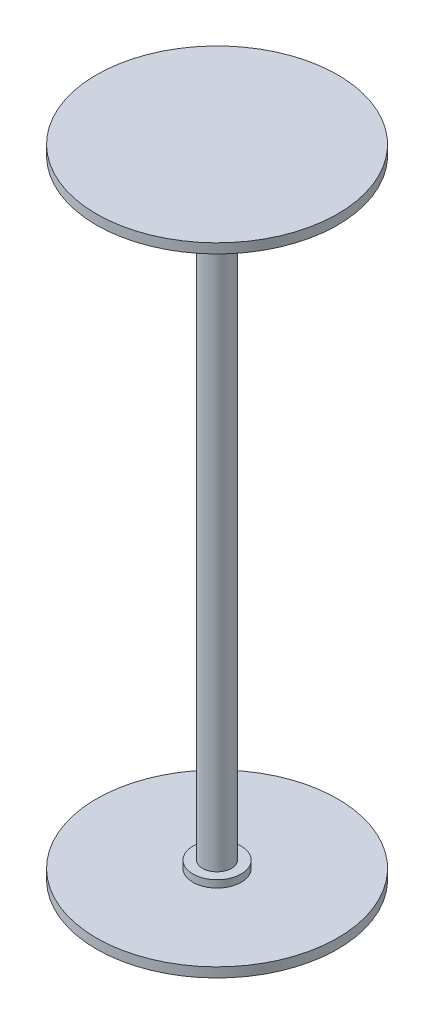
ISO-10303-21;
HEADER;
FILE_DESCRIPTION(('STEP AP214'),'2;1');
FILE_NAME('part.step','',(''),(''),'','','');
FILE_SCHEMA(('AUTOMOTIVE_DESIGN { 1 0 10303 214 1 1 1 1 }'));
ENDSEC;
DATA;
#1=APPLICATION_CONTEXT('core data for automotive mechanical design processes');
#2=APPLICATION_PROTOCOL_DEFINITION('international standard','automotive_design',2000,#1);
#3=PRODUCT_CONTEXT('',#1,'mechanical');
#4=PRODUCT('Part','Part','',(#3));
#5=PRODUCT_RELATED_PRODUCT_CATEGORY('part','',(#4));
#6=PRODUCT_DEFINITION_FORMATION('','',#4);
#7=PRODUCT_DEFINITION_CONTEXT('part definition',#1,'design');
#8=PRODUCT_DEFINITION('design','',#6,#7);
#9=PRODUCT_DEFINITION_SHAPE('','',#8);
#10=(LENGTH_UNIT() NAMED_UNIT(*) SI_UNIT(.MILLI.,.METRE.));
#11=(NAMED_UNIT(*) PLANE_ANGLE_UNIT() SI_UNIT($,.RADIAN.));
#12=(NAMED_UNIT(*) SI_UNIT($,.STERADIAN.) SOLID_ANGLE_UNIT());
#13=UNCERTAINTY_MEASURE_WITH_UNIT(LENGTH_MEASURE(1.E-05),#10,'distance_accuracy_value','');
#14=(GEOMETRIC_REPRESENTATION_CONTEXT(3) GLOBAL_UNCERTAINTY_ASSIGNED_CONTEXT((#13)) GLOBAL_UNIT_ASSIGNED_CONTEXT((#10,
#11,#12)) REPRESENTATION_CONTEXT('',''));
#15=CARTESIAN_POINT('',(0.,0.,0.));
#16=DIRECTION('',(0.,0.,1.));
#17=DIRECTION('',(1.,0.,0.));
#18=AXIS2_PLACEMENT_3D('',#15,#16,#17);
#19=CARTESIAN_POINT('',(0.,2.,0.));
#20=DIRECTION('',(0.,-1.,0.));
#21=DIRECTION('',(0.,0.,-1.));
#22=AXIS2_PLACEMENT_3D('',#19,#20,#21);
#23=CYLINDRICAL_SURFACE('',#22,25.);
#24=CARTESIAN_POINT('',(0.,2.,0.));
#25=DIRECTION('',(0.,1.,0.));
#26=DIRECTION('',(0.,0.,1.));
#27=AXIS2_PLACEMENT_3D('',#24,#25,#26);
#28=CIRCLE('',#27,25.);
#29=CARTESIAN_POINT('',(0.,2.,25.));
#30=VERTEX_POINT('',#29);
#31=EDGE_CURVE('E52',#30,#30,#28,.T.);
#32=ORIENTED_EDGE('',*,*,#31,.F.);
#33=EDGE_LOOP('',(#32));
#34=FACE_BOUND('',#33,.T.);
#35=CARTESIAN_POINT('',(0.,0.,0.));
#36=DIRECTION('',(0.,1.,0.));
#37=DIRECTION('',(0.,0.,1.));
#38=AXIS2_PLACEMENT_3D('',#35,#36,#37);
#39=CIRCLE('',#38,25.);
#40=CARTESIAN_POINT('',(0.,0.,25.));
#41=VERTEX_POINT('',#40);
#42=EDGE_CURVE('E43',#41,#41,#39,.T.);
#43=ORIENTED_EDGE('',*,*,#42,.T.);
#44=EDGE_LOOP('',(#43));
#45=FACE_BOUND('',#44,.T.);
#46=ADVANCED_FACE('F37',(#34,#45),#23,.T.);
#47=CARTESIAN_POINT('',(0.,2.,0.));
#48=DIRECTION('',(0.,1.,0.));
#49=DIRECTION('',(0.,0.,1.));
#50=AXIS2_PLACEMENT_3D('',#47,#48,#49);
#51=PLANE('',#50);
#52=CARTESIAN_POINT('',(0.,2.,0.));
#53=DIRECTION('',(0.,1.,0.));
#54=DIRECTION('',(0.,0.,1.));
#55=AXIS2_PLACEMENT_3D('',#52,#53,#54);
#56=CIRCLE('',#55,5.);
#57=CARTESIAN_POINT('',(0.,2.,5.));
#58=VERTEX_POINT('',#57);
#59=EDGE_CURVE('E48',#58,#58,#56,.T.);
#60=ORIENTED_EDGE('',*,*,#59,.F.);
#61=EDGE_LOOP('',(#60));
#62=FACE_BOUND('',#61,.T.);
#63=ORIENTED_EDGE('',*,*,#31,.T.);
#64=EDGE_LOOP('',(#63));
#65=FACE_BOUND('',#64,.T.);
#66=ADVANCED_FACE('F72',(#62,#65),#51,.T.);
#67=CARTESIAN_POINT('',(0.,0.,0.));
#68=DIRECTION('',(0.,1.,0.));
#69=DIRECTION('',(0.,0.,1.));
#70=AXIS2_PLACEMENT_3D('',#67,#68,#69);
#71=PLANE('',#70);
#72=ORIENTED_EDGE('',*,*,#42,.F.);
#73=EDGE_LOOP('',(#72));
#74=FACE_BOUND('',#73,.T.);
#75=ADVANCED_FACE('F69',(#74),#71,.F.);
#76=CARTESIAN_POINT('',(0.,3.5,0.));
#77=DIRECTION('',(0.,-1.,0.));
#78=DIRECTION('',(0.,0.,-1.));
#79=AXIS2_PLACEMENT_3D('',#76,#77,#78);
#80=CYLINDRICAL_SURFACE('',#79,5.);
#81=CARTESIAN_POINT('',(0.,3.5,0.));
#82=DIRECTION('',(0.,1.,0.));
#83=DIRECTION('',(0.,0.,1.));
#84=AXIS2_PLACEMENT_3D('',#81,#82,#83);
#85=CIRCLE('',#84,5.);
#86=CARTESIAN_POINT('',(0.,3.5,5.));
#87=VERTEX_POINT('',#86);
#88=EDGE_CURVE('E56',#87,#87,#85,.T.);
#89=ORIENTED_EDGE('',*,*,#88,.F.);
#90=EDGE_LOOP('',(#89));
#91=FACE_BOUND('',#90,.T.);
#92=ORIENTED_EDGE('',*,*,#59,.T.);
#93=EDGE_LOOP('',(#92));
#94=FACE_BOUND('',#93,.T.);
#95=ADVANCED_FACE('F70',(#91,#94),#80,.T.);
#96=CARTESIAN_POINT('',(0.,3.5,0.));
#97=DIRECTION('',(0.,1.,0.));
#98=DIRECTION('',(0.,0.,1.));
#99=AXIS2_PLACEMENT_3D('',#96,#97,#98);
#100=PLANE('',#99);
#101=CARTESIAN_POINT('',(0.,3.5,0.));
#102=DIRECTION('',(0.,1.,0.));
#103=DIRECTION('',(0.,0.,1.));
#104=AXIS2_PLACEMENT_3D('',#101,#102,#103);
#105=CIRCLE('',#104,3.);
#106=CARTESIAN_POINT('',(0.,3.5,3.));
#107=VERTEX_POINT('',#106);
#108=EDGE_CURVE('E10',#107,#107,#105,.T.);
#109=ORIENTED_EDGE('',*,*,#108,.F.);
#110=EDGE_LOOP('',(#109));
#111=FACE_BOUND('',#110,.T.);
#112=ORIENTED_EDGE('',*,*,#88,.T.);
#113=EDGE_LOOP('',(#112));
#114=FACE_BOUND('',#113,.T.);
#115=ADVANCED_FACE('F73',(#111,#114),#100,.T.);
#116=CARTESIAN_POINT('',(0.,66.,0.));
#117=DIRECTION('',(0.,-1.,0.));
#118=DIRECTION('',(0.,0.,-1.));
#119=AXIS2_PLACEMENT_3D('',#116,#117,#118);
#120=CYLINDRICAL_SURFACE('',#119,3.);
#121=ORIENTED_EDGE('',*,*,#108,.T.);
#122=EDGE_LOOP('',(#121));
#123=FACE_BOUND('',#122,.T.);
#124=CARTESIAN_POINT('',(0.,128.5,0.));
#125=DIRECTION('',(0.,1.,0.));
#126=DIRECTION('',(0.,0.,1.));
#127=AXIS2_PLACEMENT_3D('',#124,#125,#126);
#128=CIRCLE('',#127,3.);
#129=CARTESIAN_POINT('',(0.,128.5,3.));
#130=VERTEX_POINT('',#129);
#131=EDGE_CURVE('E220',#130,#130,#128,.T.);
#132=ORIENTED_EDGE('',*,*,#131,.F.);
#133=EDGE_LOOP('',(#132));
#134=FACE_BOUND('',#133,.T.);
#135=ADVANCED_FACE('F91',(#123,#134),#120,.T.);
#136=CARTESIAN_POINT('',(0.,128.5,0.));
#137=DIRECTION('',(0.,-1.,0.));
#138=DIRECTION('',(0.,0.,1.));
#139=AXIS2_PLACEMENT_3D('',#136,#137,#138);
#140=PLANE('',#139);
#141=ORIENTED_EDGE('',*,*,#131,.T.);
#142=EDGE_LOOP('',(#141));
#143=FACE_BOUND('',#142,.T.);
#144=CARTESIAN_POINT('',(0.,128.5,0.));
#145=DIRECTION('',(0.,1.,0.));
#146=DIRECTION('',(0.,0.,1.));
#147=AXIS2_PLACEMENT_3D('',#144,#145,#146);
#148=CIRCLE('',#147,5.);
#149=CARTESIAN_POINT('',(0.,128.5,5.));
#150=VERTEX_POINT('',#149);
#151=EDGE_CURVE('E214',#150,#150,#148,.T.);
#152=ORIENTED_EDGE('',*,*,#151,.F.);
#153=EDGE_LOOP('',(#152));
#154=FACE_BOUND('',#153,.T.);
#155=ADVANCED_FACE('F102',(#143,#154),#140,.T.);
#156=CARTESIAN_POINT('',(0.,128.5,0.));
#157=DIRECTION('',(0.,1.,0.));
#158=DIRECTION('',(0.,0.,-1.));
#159=AXIS2_PLACEMENT_3D('',#156,#157,#158);
#160=CYLINDRICAL_SURFACE('',#159,5.);
#161=ORIENTED_EDGE('',*,*,#151,.T.);
#162=EDGE_LOOP('',(#161));
#163=FACE_BOUND('',#162,.T.);
#164=CARTESIAN_POINT('',(0.,130.,0.));
#165=DIRECTION('',(0.,1.,0.));
#166=DIRECTION('',(0.,0.,1.));
#167=AXIS2_PLACEMENT_3D('',#164,#165,#166);
#168=CIRCLE('',#167,5.);
#169=CARTESIAN_POINT('',(0.,130.,5.));
#170=VERTEX_POINT('',#169);
#171=EDGE_CURVE('E224',#170,#170,#168,.T.);
#172=ORIENTED_EDGE('',*,*,#171,.F.);
#173=EDGE_LOOP('',(#172));
#174=FACE_BOUND('',#173,.T.);
#175=ADVANCED_FACE('F156',(#163,#174),#160,.T.);
#176=CARTESIAN_POINT('',(0.,132.,0.));
#177=DIRECTION('',(0.,-1.,0.));
#178=DIRECTION('',(0.,0.,1.));
#179=AXIS2_PLACEMENT_3D('',#176,#177,#178);
#180=PLANE('',#179);
#181=CARTESIAN_POINT('',(0.,132.,0.));
#182=DIRECTION('',(0.,1.,0.));
#183=DIRECTION('',(0.,0.,1.));
#184=AXIS2_PLACEMENT_3D('',#181,#182,#183);
#185=CIRCLE('',#184,25.);
#186=CARTESIAN_POINT('',(0.,132.,25.));
#187=VERTEX_POINT('',#186);
#188=EDGE_CURVE('E217',#187,#187,#185,.T.);
#189=ORIENTED_EDGE('',*,*,#188,.T.);
#190=EDGE_LOOP('',(#189));
#191=FACE_BOUND('',#190,.T.);
#192=ADVANCED_FACE('F146',(#191),#180,.F.);
#193=CARTESIAN_POINT('',(0.,130.,0.));
#194=DIRECTION('',(0.,-1.,0.));
#195=DIRECTION('',(0.,0.,1.));
#196=AXIS2_PLACEMENT_3D('',#193,#194,#195);
#197=PLANE('',#196);
#198=ORIENTED_EDGE('',*,*,#171,.T.);
#199=EDGE_LOOP('',(#198));
#200=FACE_BOUND('',#199,.T.);
#201=CARTESIAN_POINT('',(0.,130.,0.));
#202=DIRECTION('',(0.,1.,0.));
#203=DIRECTION('',(0.,0.,1.));
#204=AXIS2_PLACEMENT_3D('',#201,#202,#203);
#205=CIRCLE('',#204,25.);
#206=CARTESIAN_POINT('',(0.,130.,25.));
#207=VERTEX_POINT('',#206);
#208=EDGE_CURVE('E228',#207,#207,#205,.T.);
#209=ORIENTED_EDGE('',*,*,#208,.F.);
#210=EDGE_LOOP('',(#209));
#211=FACE_BOUND('',#210,.T.);
#212=ADVANCED_FACE('F142',(#200,#211),#197,.T.);
#213=CARTESIAN_POINT('',(0.,130.,0.));
#214=DIRECTION('',(0.,1.,0.));
#215=DIRECTION('',(0.,0.,-1.));
#216=AXIS2_PLACEMENT_3D('',#213,#214,#215);
#217=CYLINDRICAL_SURFACE('',#216,25.);
#218=ORIENTED_EDGE('',*,*,#208,.T.);
#219=EDGE_LOOP('',(#218));
#220=FACE_BOUND('',#219,.T.);
#221=ORIENTED_EDGE('',*,*,#188,.F.);
#222=EDGE_LOOP('',(#221));
#223=FACE_BOUND('',#222,.T.);
#224=ADVANCED_FACE('F139',(#220,#223),#217,.T.);
#225=CLOSED_SHELL('',(#46,#66,#75,#95,#115,#135,#155,#175,#192,#212,#224));
#226=CARTESIAN_POINT('',(0.,57.,0.));
#227=DIRECTION('',(0.,1.,0.));
#228=DIRECTION('',(0.,0.,1.));
#229=AXIS2_PLACEMENT_3D('',#226,#227,#228);
#230=PLANE('',#229);
#231=CARTESIAN_POINT('',(0.,57.,0.));
#232=DIRECTION('',(0.,1.,0.));
#233=DIRECTION('',(0.,0.,1.));
#234=AXIS2_PLACEMENT_3D('',#231,#232,#233);
#235=CIRCLE('',#234,1.05);
#236=CARTESIAN_POINT('',(0.,57.,1.05));
#237=VERTEX_POINT('',#236);
#238=EDGE_CURVE('E60',#237,#237,#235,.T.);
#239=ORIENTED_EDGE('',*,*,#238,.T.);
#240=EDGE_LOOP('',(#239));
#241=FACE_BOUND('',#240,.T.);
#242=ADVANCED_FACE('F119',(#241),#230,.T.);
#243=CARTESIAN_POINT('',(0.,57.,0.));
#244=DIRECTION('',(0.,1.,0.));
#245=DIRECTION('',(0.,0.,1.));
#246=AXIS2_PLACEMENT_3D('',#243,#244,#245);
#247=CYLINDRICAL_SURFACE('',#246,1.05);
#248=ORIENTED_EDGE('',*,*,#238,.F.);
#249=EDGE_LOOP('',(#248));
#250=FACE_BOUND('',#249,.T.);
#251=CARTESIAN_POINT('',(0.,75.,0.));
#252=DIRECTION('',(0.,1.,0.));
#253=DIRECTION('',(0.,0.,1.));
#254=AXIS2_PLACEMENT_3D('',#251,#252,#253);
#255=CIRCLE('',#254,1.05);
#256=CARTESIAN_POINT('',(0.,75.,1.05));
#257=VERTEX_POINT('',#256);
#258=EDGE_CURVE('E215',#257,#257,#255,.T.);
#259=ORIENTED_EDGE('',*,*,#258,.T.);
#260=EDGE_LOOP('',(#259));
#261=FACE_BOUND('',#260,.T.);
#262=ADVANCED_FACE('F112',(#250,#261),#247,.F.);
#263=CARTESIAN_POINT('',(0.,75.,0.));
#264=DIRECTION('',(0.,-1.,0.));
#265=DIRECTION('',(0.,0.,1.));
#266=AXIS2_PLACEMENT_3D('',#263,#264,#265);
#267=PLANE('',#266);
#268=ORIENTED_EDGE('',*,*,#258,.F.);
#269=EDGE_LOOP('',(#268));
#270=FACE_BOUND('',#269,.T.);
#271=ADVANCED_FACE('F118',(#270),#267,.T.);
#272=CLOSED_SHELL('',(#242,#262,#271));
#273=ORIENTED_CLOSED_SHELL('',*,#272,.T.);
#274=BREP_WITH_VOIDS('B2',#225,(#273));
#275=ADVANCED_BREP_SHAPE_REPRESENTATION('',(#18,#274),#14);
#276=SHAPE_DEFINITION_REPRESENTATION(#9,#275);
ENDSEC;
END-ISO-10303-21;
